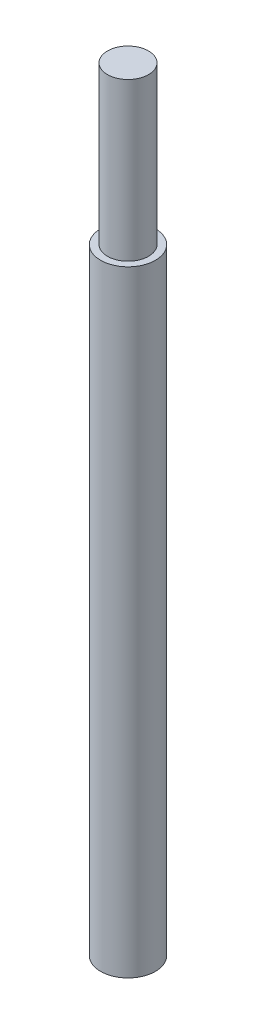
ISO-10303-21;
HEADER;
FILE_DESCRIPTION(('STEP AP214'),'2;1');
FILE_NAME('part.step','',(''),(''),'','','');
FILE_SCHEMA(('AUTOMOTIVE_DESIGN { 1 0 10303 214 1 1 1 1 }'));
ENDSEC;
DATA;
#1=APPLICATION_CONTEXT('core data for automotive mechanical design processes');
#2=APPLICATION_PROTOCOL_DEFINITION('international standard','automotive_design',2000,#1);
#3=PRODUCT_CONTEXT('',#1,'mechanical');
#4=PRODUCT('Part','Part','',(#3));
#5=PRODUCT_RELATED_PRODUCT_CATEGORY('part','',(#4));
#6=PRODUCT_DEFINITION_FORMATION('','',#4);
#7=PRODUCT_DEFINITION_CONTEXT('part definition',#1,'design');
#8=PRODUCT_DEFINITION('design','',#6,#7);
#9=PRODUCT_DEFINITION_SHAPE('','',#8);
#10=(LENGTH_UNIT() NAMED_UNIT(*) SI_UNIT(.MILLI.,.METRE.));
#11=(NAMED_UNIT(*) PLANE_ANGLE_UNIT() SI_UNIT($,.RADIAN.));
#12=(NAMED_UNIT(*) SI_UNIT($,.STERADIAN.) SOLID_ANGLE_UNIT());
#13=UNCERTAINTY_MEASURE_WITH_UNIT(LENGTH_MEASURE(1.E-05),#10,'distance_accuracy_value','');
#14=(GEOMETRIC_REPRESENTATION_CONTEXT(3) GLOBAL_UNCERTAINTY_ASSIGNED_CONTEXT((#13)) GLOBAL_UNIT_ASSIGNED_CONTEXT((#10,
#11,#12)) REPRESENTATION_CONTEXT('',''));
#15=CARTESIAN_POINT('',(0.,0.,0.));
#16=DIRECTION('',(0.,0.,1.));
#17=DIRECTION('',(1.,0.,0.));
#18=AXIS2_PLACEMENT_3D('',#15,#16,#17);
#19=CARTESIAN_POINT('',(0.,90.,0.));
#20=DIRECTION('',(0.,-1.,0.));
#21=DIRECTION('',(0.,0.,-1.));
#22=AXIS2_PLACEMENT_3D('',#19,#20,#21);
#23=CYLINDRICAL_SURFACE('',#22,4.);
#24=CARTESIAN_POINT('',(0.,90.,0.));
#25=DIRECTION('',(0.,1.,0.));
#26=DIRECTION('',(0.,0.,1.));
#27=AXIS2_PLACEMENT_3D('',#24,#25,#26);
#28=CIRCLE('',#27,4.);
#29=CARTESIAN_POINT('',(0.,90.,-4.));
#30=VERTEX_POINT('',#29);
#31=EDGE_CURVE('E44',#30,#30,#28,.T.);
#32=CARTESIAN_POINT('',(0.,0.,0.));
#33=DIRECTION('',(0.,1.,0.));
#34=DIRECTION('',(0.,0.,1.));
#35=AXIS2_PLACEMENT_3D('',#32,#33,#34);
#36=CIRCLE('',#35,4.);
#37=CARTESIAN_POINT('',(0.,0.,-4.));
#38=VERTEX_POINT('',#37);
#39=EDGE_CURVE('E40',#38,#38,#36,.T.);
#40=CARTESIAN_POINT('',(0.,90.,-4.));
#41=CARTESIAN_POINT('',(0.,89.0625,-4.));
#42=CARTESIAN_POINT('',(0.,88.125,-4.));
#43=CARTESIAN_POINT('',(0.,86.25,-4.));
#44=CARTESIAN_POINT('',(0.,85.3125,-4.));
#45=CARTESIAN_POINT('',(0.,83.4375,-4.));
#46=CARTESIAN_POINT('',(0.,82.5,-4.));
#47=CARTESIAN_POINT('',(0.,80.625,-4.));
#48=CARTESIAN_POINT('',(0.,79.6875,-4.));
#49=CARTESIAN_POINT('',(0.,77.8125,-4.));
#50=CARTESIAN_POINT('',(0.,76.875,-4.));
#51=CARTESIAN_POINT('',(0.,75.,-4.));
#52=CARTESIAN_POINT('',(0.,74.0625,-4.));
#53=CARTESIAN_POINT('',(0.,72.1875,-4.));
#54=CARTESIAN_POINT('',(0.,71.25,-4.));
#55=CARTESIAN_POINT('',(0.,69.375,-4.));
#56=CARTESIAN_POINT('',(0.,68.4375,-4.));
#57=CARTESIAN_POINT('',(0.,66.5625,-4.));
#58=CARTESIAN_POINT('',(0.,65.625,-4.));
#59=CARTESIAN_POINT('',(0.,63.75,-4.));
#60=CARTESIAN_POINT('',(0.,62.8125,-4.));
#61=CARTESIAN_POINT('',(0.,60.9375,-4.));
#62=CARTESIAN_POINT('',(0.,60.,-4.));
#63=CARTESIAN_POINT('',(0.,58.125,-4.));
#64=CARTESIAN_POINT('',(0.,57.1875,-4.));
#65=CARTESIAN_POINT('',(0.,55.3125,-4.));
#66=CARTESIAN_POINT('',(0.,54.375,-4.));
#67=CARTESIAN_POINT('',(0.,52.5,-4.));
#68=CARTESIAN_POINT('',(0.,51.5625,-4.));
#69=CARTESIAN_POINT('',(0.,49.6875,-4.));
#70=CARTESIAN_POINT('',(0.,48.75,-4.));
#71=CARTESIAN_POINT('',(0.,46.875,-4.));
#72=CARTESIAN_POINT('',(0.,45.9375,-4.));
#73=CARTESIAN_POINT('',(0.,44.0625,-4.));
#74=CARTESIAN_POINT('',(0.,43.125,-4.));
#75=CARTESIAN_POINT('',(0.,41.25,-4.));
#76=CARTESIAN_POINT('',(0.,40.3125,-4.));
#77=CARTESIAN_POINT('',(0.,38.4375,-4.));
#78=CARTESIAN_POINT('',(0.,37.5,-4.));
#79=CARTESIAN_POINT('',(0.,35.625,-4.));
#80=CARTESIAN_POINT('',(0.,34.6875,-4.));
#81=CARTESIAN_POINT('',(0.,32.8125,-4.));
#82=CARTESIAN_POINT('',(0.,31.875,-4.));
#83=CARTESIAN_POINT('',(0.,30.,-4.));
#84=CARTESIAN_POINT('',(0.,29.0625,-4.));
#85=CARTESIAN_POINT('',(0.,27.1875,-4.));
#86=CARTESIAN_POINT('',(0.,26.25,-4.));
#87=CARTESIAN_POINT('',(0.,24.375,-4.));
#88=CARTESIAN_POINT('',(0.,23.4375,-4.));
#89=CARTESIAN_POINT('',(0.,21.5625,-4.));
#90=CARTESIAN_POINT('',(0.,20.625,-4.));
#91=CARTESIAN_POINT('',(0.,18.75,-4.));
#92=CARTESIAN_POINT('',(0.,17.8125,-4.));
#93=CARTESIAN_POINT('',(0.,15.9375,-4.));
#94=CARTESIAN_POINT('',(0.,15.,-4.));
#95=CARTESIAN_POINT('',(0.,13.125,-4.));
#96=CARTESIAN_POINT('',(0.,12.1875,-4.));
#97=CARTESIAN_POINT('',(0.,10.3125,-4.));
#98=CARTESIAN_POINT('',(0.,9.37499999999999,-4.));
#99=CARTESIAN_POINT('',(0.,7.49999999999999,-4.));
#100=CARTESIAN_POINT('',(0.,6.56249999999999,-4.));
#101=CARTESIAN_POINT('',(0.,4.68749999999999,-4.));
#102=CARTESIAN_POINT('',(0.,3.74999999999998,-4.));
#103=CARTESIAN_POINT('',(0.,1.87499999999998,-4.));
#104=CARTESIAN_POINT('',(0.,0.937499999999986,-4.));
#105=CARTESIAN_POINT('',(0.,0.,-4.));
#106=B_SPLINE_CURVE_WITH_KNOTS('',3,(#40,#41,#42,#43,#44,#45,#46,#47,#48,#49,#50,#51,#52,#53,
#54,#55,#56,#57,#58,#59,#60,#61,#62,#63,#64,#65,#66,#67,#68,#69,#70,#71,#72,#73,#74,#75,#76,#77,
#78,#79,#80,#81,#82,#83,#84,#85,#86,#87,#88,#89,#90,#91,#92,#93,#94,#95,#96,#97,#98,#99,#100,
#101,#102,#103,#104,#105),.UNSPECIFIED.,.F.,.F.,(4,2,2,2,2,2,2,2,2,2,2,2,2,2,2,2,2,2,2,2,2,2,2,
2,2,2,2,2,2,2,2,2,4),(0.,2.8125,5.62499999999999,8.43749999999999,11.25,14.0625,16.875,19.6875,
22.5,25.3125,28.125,30.9375,33.75,36.5625,39.375,42.1875,45.,47.8125,50.625,53.4375,56.25,
59.0625,61.875,64.6875,67.5,70.3125,73.125,75.9375,78.75,81.5625,84.375,87.1875,90.),.UNSPECIFIED.);
#107=EDGE_CURVE('BSEAM37',#30,#38,#106,.T.);
#108=ORIENTED_EDGE('',*,*,#31,.F.);
#109=ORIENTED_EDGE('',*,*,#39,.T.);
#110=ORIENTED_EDGE('',*,*,#107,.T.);
#111=ORIENTED_EDGE('',*,*,#107,.F.);
#112=EDGE_LOOP('',(#108,#110,#109,#111));
#113=FACE_BOUND('',#112,.T.);
#114=ADVANCED_FACE('F37',(#113),#23,.T.);
#115=CARTESIAN_POINT('',(0.,90.,0.));
#116=DIRECTION('',(0.,1.,0.));
#117=DIRECTION('',(0.,0.,1.));
#118=AXIS2_PLACEMENT_3D('',#115,#116,#117);
#119=PLANE('',#118);
#120=CARTESIAN_POINT('',(0.,90.,0.));
#121=DIRECTION('',(0.,1.,0.));
#122=DIRECTION('',(0.,0.,1.));
#123=AXIS2_PLACEMENT_3D('',#120,#121,#122);
#124=CIRCLE('',#123,3.);
#125=CARTESIAN_POINT('',(0.,90.,3.));
#126=VERTEX_POINT('',#125);
#127=EDGE_CURVE('E10',#126,#126,#124,.T.);
#128=ORIENTED_EDGE('',*,*,#127,.F.);
#129=EDGE_LOOP('',(#128));
#130=FACE_BOUND('',#129,.T.);
#131=ORIENTED_EDGE('',*,*,#31,.T.);
#132=EDGE_LOOP('',(#131));
#133=FACE_BOUND('',#132,.T.);
#134=ADVANCED_FACE('F61',(#130,#133),#119,.T.);
#135=CARTESIAN_POINT('',(0.,0.,0.));
#136=DIRECTION('',(0.,1.,0.));
#137=DIRECTION('',(0.,0.,1.));
#138=AXIS2_PLACEMENT_3D('',#135,#136,#137);
#139=PLANE('',#138);
#140=ORIENTED_EDGE('',*,*,#39,.F.);
#141=EDGE_LOOP('',(#140));
#142=FACE_BOUND('',#141,.T.);
#143=ADVANCED_FACE('F58',(#142),#139,.F.);
#144=CARTESIAN_POINT('',(0.,113.,0.));
#145=DIRECTION('',(0.,-1.,0.));
#146=DIRECTION('',(0.,0.,-1.));
#147=AXIS2_PLACEMENT_3D('',#144,#145,#146);
#148=CYLINDRICAL_SURFACE('',#147,3.);
#149=CARTESIAN_POINT('',(0.,113.,0.));
#150=DIRECTION('',(0.,1.,0.));
#151=DIRECTION('',(0.,0.,1.));
#152=AXIS2_PLACEMENT_3D('',#149,#150,#151);
#153=CIRCLE('',#152,3.);
#154=CARTESIAN_POINT('',(0.,113.,3.));
#155=VERTEX_POINT('',#154);
#156=EDGE_CURVE('E50',#155,#155,#153,.T.);
#157=ORIENTED_EDGE('',*,*,#156,.F.);
#158=EDGE_LOOP('',(#157));
#159=FACE_BOUND('',#158,.T.);
#160=ORIENTED_EDGE('',*,*,#127,.T.);
#161=EDGE_LOOP('',(#160));
#162=FACE_BOUND('',#161,.T.);
#163=ADVANCED_FACE('F60',(#159,#162),#148,.T.);
#164=CARTESIAN_POINT('',(0.,113.,0.));
#165=DIRECTION('',(0.,1.,0.));
#166=DIRECTION('',(0.,0.,1.));
#167=AXIS2_PLACEMENT_3D('',#164,#165,#166);
#168=PLANE('',#167);
#169=ORIENTED_EDGE('',*,*,#156,.T.);
#170=EDGE_LOOP('',(#169));
#171=FACE_BOUND('',#170,.T.);
#172=ADVANCED_FACE('F66',(#171),#168,.T.);
#173=CLOSED_SHELL('',(#114,#134,#143,#163,#172));
#174=MANIFOLD_SOLID_BREP('B2',#173);
#175=ADVANCED_BREP_SHAPE_REPRESENTATION('',(#18,#174),#14);
#176=SHAPE_DEFINITION_REPRESENTATION(#9,#175);
ENDSEC;
END-ISO-10303-21;
